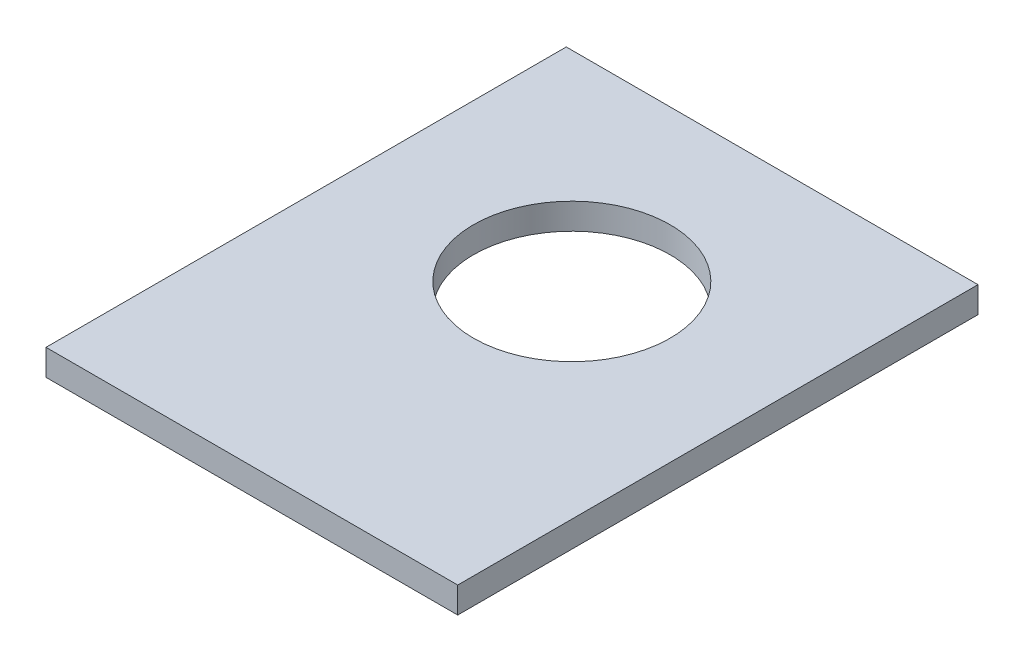
ISO-10303-21;
HEADER;
FILE_DESCRIPTION(('STEP AP214'),'2;1');
FILE_NAME('part.step','',(''),(''),'','','');
FILE_SCHEMA(('AUTOMOTIVE_DESIGN { 1 0 10303 214 1 1 1 1 }'));
ENDSEC;
DATA;
#1=APPLICATION_CONTEXT('core data for automotive mechanical design processes');
#2=APPLICATION_PROTOCOL_DEFINITION('international standard','automotive_design',2000,#1);
#3=PRODUCT_CONTEXT('',#1,'mechanical');
#4=PRODUCT('Part','Part','',(#3));
#5=PRODUCT_RELATED_PRODUCT_CATEGORY('part','',(#4));
#6=PRODUCT_DEFINITION_FORMATION('','',#4);
#7=PRODUCT_DEFINITION_CONTEXT('part definition',#1,'design');
#8=PRODUCT_DEFINITION('design','',#6,#7);
#9=PRODUCT_DEFINITION_SHAPE('','',#8);
#10=(LENGTH_UNIT() NAMED_UNIT(*) SI_UNIT(.MILLI.,.METRE.));
#11=(NAMED_UNIT(*) PLANE_ANGLE_UNIT() SI_UNIT($,.RADIAN.));
#12=(NAMED_UNIT(*) SI_UNIT($,.STERADIAN.) SOLID_ANGLE_UNIT());
#13=UNCERTAINTY_MEASURE_WITH_UNIT(LENGTH_MEASURE(1.E-05),#10,'distance_accuracy_value','');
#14=(GEOMETRIC_REPRESENTATION_CONTEXT(3) GLOBAL_UNCERTAINTY_ASSIGNED_CONTEXT((#13)) GLOBAL_UNIT_ASSIGNED_CONTEXT((#10,
#11,#12)) REPRESENTATION_CONTEXT('',''));
#15=CARTESIAN_POINT('',(0.,0.,0.));
#16=DIRECTION('',(0.,0.,1.));
#17=DIRECTION('',(1.,0.,0.));
#18=AXIS2_PLACEMENT_3D('',#15,#16,#17);
#19=CARTESIAN_POINT('',(0.,1.5875,0.));
#20=DIRECTION('',(0.,1.,0.));
#21=DIRECTION('',(0.,0.,1.));
#22=AXIS2_PLACEMENT_3D('',#19,#20,#21);
#23=PLANE('',#22);
#24=DIRECTION('',(0.,0.,1.));
#25=VECTOR('',#24,1.);
#26=CARTESIAN_POINT('',(0.,1.5875,0.));
#27=LINE('',#26,#25);
#28=CARTESIAN_POINT('',(0.,1.5875,0.));
#29=VERTEX_POINT('',#28);
#30=CARTESIAN_POINT('',(0.,1.5875,31.75));
#31=VERTEX_POINT('',#30);
#32=EDGE_CURVE('E103',#29,#31,#27,.T.);
#33=ORIENTED_EDGE('',*,*,#32,.T.);
#34=DIRECTION('',(1.,0.,0.));
#35=VECTOR('',#34,1.);
#36=CARTESIAN_POINT('',(0.,1.5875,31.75));
#37=LINE('',#36,#35);
#38=CARTESIAN_POINT('',(25.1258190391336,1.5875,31.75));
#39=VERTEX_POINT('',#38);
#40=EDGE_CURVE('E98',#31,#39,#37,.T.);
#41=ORIENTED_EDGE('',*,*,#40,.T.);
#42=DIRECTION('',(0.,0.,-1.));
#43=VECTOR('',#42,1.);
#44=CARTESIAN_POINT('',(25.1258190391336,1.5875,0.));
#45=LINE('',#44,#43);
#46=CARTESIAN_POINT('',(25.1258190391336,1.5875,0.));
#47=VERTEX_POINT('',#46);
#48=EDGE_CURVE('E101',#39,#47,#45,.T.);
#49=ORIENTED_EDGE('',*,*,#48,.T.);
#50=DIRECTION('',(-1.,0.,0.));
#51=VECTOR('',#50,1.);
#52=CARTESIAN_POINT('',(0.,1.5875,0.));
#53=LINE('',#52,#51);
#54=EDGE_CURVE('E68',#47,#29,#53,.T.);
#55=ORIENTED_EDGE('',*,*,#54,.T.);
#56=EDGE_LOOP('',(#33,#41,#49,#55));
#57=FACE_BOUND('',#56,.T.);
#58=CARTESIAN_POINT('',(12.5629095195668,1.5875,12.2245768314547));
#59=DIRECTION('',(0.,1.,0.));
#60=DIRECTION('',(0.,0.,1.));
#61=AXIS2_PLACEMENT_3D('',#58,#59,#60);
#62=CIRCLE('',#61,6.);
#63=CARTESIAN_POINT('',(12.5629095195668,1.5875,18.2245768314547));
#64=VERTEX_POINT('',#63);
#65=EDGE_CURVE('E124',#64,#64,#62,.T.);
#66=ORIENTED_EDGE('',*,*,#65,.F.);
#67=EDGE_LOOP('',(#66));
#68=FACE_BOUND('',#67,.T.);
#69=ADVANCED_FACE('F50',(#57,#68),#23,.T.);
#70=CARTESIAN_POINT('',(0.,0.,0.));
#71=DIRECTION('',(0.,1.,0.));
#72=DIRECTION('',(0.,0.,1.));
#73=AXIS2_PLACEMENT_3D('',#70,#71,#72);
#74=PLANE('',#73);
#75=DIRECTION('',(0.,0.,1.));
#76=VECTOR('',#75,1.);
#77=CARTESIAN_POINT('',(0.,0.,0.));
#78=LINE('',#77,#76);
#79=CARTESIAN_POINT('',(0.,0.,0.));
#80=VERTEX_POINT('',#79);
#81=CARTESIAN_POINT('',(0.,0.,31.75));
#82=VERTEX_POINT('',#81);
#83=EDGE_CURVE('E120',#80,#82,#78,.T.);
#84=ORIENTED_EDGE('',*,*,#83,.F.);
#85=DIRECTION('',(-1.,0.,0.));
#86=VECTOR('',#85,1.);
#87=CARTESIAN_POINT('',(0.,0.,0.));
#88=LINE('',#87,#86);
#89=CARTESIAN_POINT('',(25.1258190391336,0.,0.));
#90=VERTEX_POINT('',#89);
#91=EDGE_CURVE('E91',#90,#80,#88,.T.);
#92=ORIENTED_EDGE('',*,*,#91,.F.);
#93=DIRECTION('',(0.,0.,-1.));
#94=VECTOR('',#93,1.);
#95=CARTESIAN_POINT('',(25.1258190391336,0.,0.));
#96=LINE('',#95,#94);
#97=CARTESIAN_POINT('',(25.1258190391336,0.,31.75));
#98=VERTEX_POINT('',#97);
#99=EDGE_CURVE('E85',#98,#90,#96,.T.);
#100=ORIENTED_EDGE('',*,*,#99,.F.);
#101=DIRECTION('',(1.,0.,0.));
#102=VECTOR('',#101,1.);
#103=CARTESIAN_POINT('',(0.,0.,31.75));
#104=LINE('',#103,#102);
#105=EDGE_CURVE('E108',#82,#98,#104,.T.);
#106=ORIENTED_EDGE('',*,*,#105,.F.);
#107=EDGE_LOOP('',(#84,#92,#100,#106));
#108=FACE_BOUND('',#107,.T.);
#109=CARTESIAN_POINT('',(12.5629095195668,0.,12.2245768314547));
#110=DIRECTION('',(0.,1.,0.));
#111=DIRECTION('',(0.,0.,1.));
#112=AXIS2_PLACEMENT_3D('',#109,#110,#111);
#113=CIRCLE('',#112,6.);
#114=CARTESIAN_POINT('',(12.5629095195668,0.,18.2245768314547));
#115=VERTEX_POINT('',#114);
#116=EDGE_CURVE('E137',#115,#115,#113,.T.);
#117=ORIENTED_EDGE('',*,*,#116,.T.);
#118=EDGE_LOOP('',(#117));
#119=FACE_BOUND('',#118,.T.);
#120=ADVANCED_FACE('F151',(#108,#119),#74,.F.);
#121=CARTESIAN_POINT('',(0.,1.5875,0.));
#122=DIRECTION('',(1.,0.,0.));
#123=DIRECTION('',(0.,0.,-1.));
#124=AXIS2_PLACEMENT_3D('',#121,#122,#123);
#125=PLANE('',#124);
#126=ORIENTED_EDGE('',*,*,#83,.T.);
#127=DIRECTION('',(0.,-1.,0.));
#128=VECTOR('',#127,1.);
#129=CARTESIAN_POINT('',(0.,1.5875,31.75));
#130=LINE('',#129,#128);
#131=EDGE_CURVE('E12',#31,#82,#130,.T.);
#132=ORIENTED_EDGE('',*,*,#131,.F.);
#133=ORIENTED_EDGE('',*,*,#32,.F.);
#134=DIRECTION('',(0.,-1.,0.));
#135=VECTOR('',#134,1.);
#136=CARTESIAN_POINT('',(0.,1.5875,0.));
#137=LINE('',#136,#135);
#138=EDGE_CURVE('E114',#29,#80,#137,.T.);
#139=ORIENTED_EDGE('',*,*,#138,.T.);
#140=EDGE_LOOP('',(#126,#132,#133,#139));
#141=FACE_BOUND('',#140,.T.);
#142=ADVANCED_FACE('F52',(#141),#125,.F.);
#143=CARTESIAN_POINT('',(0.,1.5875,31.75));
#144=DIRECTION('',(0.,0.,-1.));
#145=DIRECTION('',(-1.,0.,0.));
#146=AXIS2_PLACEMENT_3D('',#143,#144,#145);
#147=PLANE('',#146);
#148=ORIENTED_EDGE('',*,*,#105,.T.);
#149=DIRECTION('',(0.,-1.,0.));
#150=VECTOR('',#149,1.);
#151=CARTESIAN_POINT('',(25.1258190391336,1.5875,31.75));
#152=LINE('',#151,#150);
#153=EDGE_CURVE('E60',#39,#98,#152,.T.);
#154=ORIENTED_EDGE('',*,*,#153,.F.);
#155=ORIENTED_EDGE('',*,*,#40,.F.);
#156=ORIENTED_EDGE('',*,*,#131,.T.);
#157=EDGE_LOOP('',(#148,#154,#155,#156));
#158=FACE_BOUND('',#157,.T.);
#159=ADVANCED_FACE('F107',(#158),#147,.F.);
#160=CARTESIAN_POINT('',(25.1258190391336,1.5875,0.));
#161=DIRECTION('',(-1.,0.,0.));
#162=DIRECTION('',(0.,0.,1.));
#163=AXIS2_PLACEMENT_3D('',#160,#161,#162);
#164=PLANE('',#163);
#165=ORIENTED_EDGE('',*,*,#99,.T.);
#166=DIRECTION('',(0.,-1.,0.));
#167=VECTOR('',#166,1.);
#168=CARTESIAN_POINT('',(25.1258190391336,1.5875,0.));
#169=LINE('',#168,#167);
#170=EDGE_CURVE('E110',#47,#90,#169,.T.);
#171=ORIENTED_EDGE('',*,*,#170,.F.);
#172=ORIENTED_EDGE('',*,*,#48,.F.);
#173=ORIENTED_EDGE('',*,*,#153,.T.);
#174=EDGE_LOOP('',(#165,#171,#172,#173));
#175=FACE_BOUND('',#174,.T.);
#176=ADVANCED_FACE('F111',(#175),#164,.F.);
#177=CARTESIAN_POINT('',(0.,1.5875,0.));
#178=DIRECTION('',(0.,0.,1.));
#179=DIRECTION('',(1.,0.,0.));
#180=AXIS2_PLACEMENT_3D('',#177,#178,#179);
#181=PLANE('',#180);
#182=ORIENTED_EDGE('',*,*,#91,.T.);
#183=ORIENTED_EDGE('',*,*,#138,.F.);
#184=ORIENTED_EDGE('',*,*,#54,.F.);
#185=ORIENTED_EDGE('',*,*,#170,.T.);
#186=EDGE_LOOP('',(#182,#183,#184,#185));
#187=FACE_BOUND('',#186,.T.);
#188=ADVANCED_FACE('F148',(#187),#181,.F.);
#189=CARTESIAN_POINT('',(12.5629095195668,1.5875,12.2245768314547));
#190=DIRECTION('',(0.,-1.,0.));
#191=DIRECTION('',(0.,0.,-1.));
#192=AXIS2_PLACEMENT_3D('',#189,#190,#191);
#193=CYLINDRICAL_SURFACE('',#192,6.);
#194=ORIENTED_EDGE('',*,*,#65,.T.);
#195=EDGE_LOOP('',(#194));
#196=FACE_BOUND('',#195,.T.);
#197=ORIENTED_EDGE('',*,*,#116,.F.);
#198=EDGE_LOOP('',(#197));
#199=FACE_BOUND('',#198,.T.);
#200=ADVANCED_FACE('F166',(#196,#199),#193,.F.);
#201=CLOSED_SHELL('',(#69,#120,#142,#159,#176,#188,#200));
#202=MANIFOLD_SOLID_BREP('B2',#201);
#203=ADVANCED_BREP_SHAPE_REPRESENTATION('',(#18,#202),#14);
#204=SHAPE_DEFINITION_REPRESENTATION(#9,#203);
ENDSEC;
END-ISO-10303-21;
